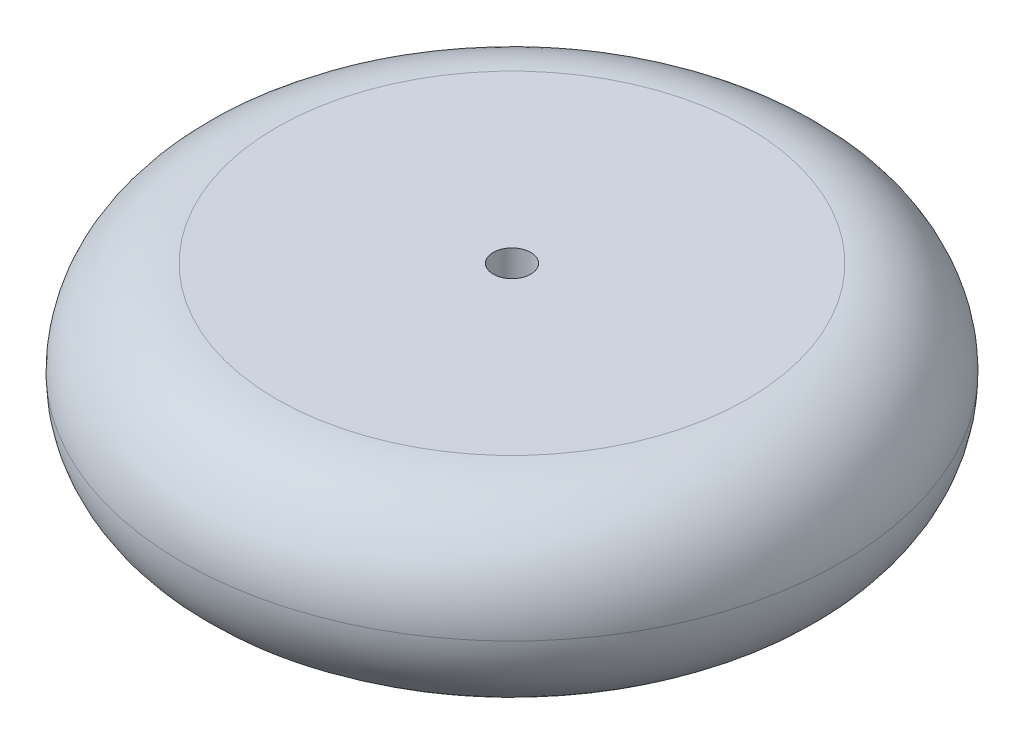
ISO-10303-21;
HEADER;
FILE_DESCRIPTION(('STEP AP214'),'2;1');
FILE_NAME('part.step','',(''),(''),'','','');
FILE_SCHEMA(('AUTOMOTIVE_DESIGN { 1 0 10303 214 1 1 1 1 }'));
ENDSEC;
DATA;
#1=APPLICATION_CONTEXT('core data for automotive mechanical design processes');
#2=APPLICATION_PROTOCOL_DEFINITION('international standard','automotive_design',2000,#1);
#3=PRODUCT_CONTEXT('',#1,'mechanical');
#4=PRODUCT('Part','Part','',(#3));
#5=PRODUCT_RELATED_PRODUCT_CATEGORY('part','',(#4));
#6=PRODUCT_DEFINITION_FORMATION('','',#4);
#7=PRODUCT_DEFINITION_CONTEXT('part definition',#1,'design');
#8=PRODUCT_DEFINITION('design','',#6,#7);
#9=PRODUCT_DEFINITION_SHAPE('','',#8);
#10=(LENGTH_UNIT() NAMED_UNIT(*) SI_UNIT(.MILLI.,.METRE.));
#11=(NAMED_UNIT(*) PLANE_ANGLE_UNIT() SI_UNIT($,.RADIAN.));
#12=(NAMED_UNIT(*) SI_UNIT($,.STERADIAN.) SOLID_ANGLE_UNIT());
#13=UNCERTAINTY_MEASURE_WITH_UNIT(LENGTH_MEASURE(1.E-05),#10,'distance_accuracy_value','');
#14=(GEOMETRIC_REPRESENTATION_CONTEXT(3) GLOBAL_UNCERTAINTY_ASSIGNED_CONTEXT((#13)) GLOBAL_UNIT_ASSIGNED_CONTEXT((#10,
#11,#12)) REPRESENTATION_CONTEXT('',''));
#15=CARTESIAN_POINT('',(0.,0.,0.));
#16=DIRECTION('',(0.,0.,1.));
#17=DIRECTION('',(1.,0.,0.));
#18=AXIS2_PLACEMENT_3D('',#15,#16,#17);
#19=CARTESIAN_POINT('',(0.,4.,0.));
#20=DIRECTION('',(0.,1.,0.));
#21=DIRECTION('',(0.,0.,1.));
#22=AXIS2_PLACEMENT_3D('',#19,#20,#21);
#23=PLANE('',#22);
#24=CARTESIAN_POINT('',(0.,4.,0.));
#25=DIRECTION('',(0.,1.,0.));
#26=DIRECTION('',(0.,0.,1.));
#27=AXIS2_PLACEMENT_3D('',#24,#25,#26);
#28=CIRCLE('',#27,5.);
#29=CARTESIAN_POINT('',(0.,4.,5.));
#30=VERTEX_POINT('',#29);
#31=EDGE_CURVE('E10',#30,#30,#28,.T.);
#32=ORIENTED_EDGE('',*,*,#31,.T.);
#33=EDGE_LOOP('',(#32));
#34=FACE_BOUND('',#33,.T.);
#35=CARTESIAN_POINT('',(0.,4.,0.));
#36=DIRECTION('',(0.,1.,0.));
#37=DIRECTION('',(0.,0.,1.));
#38=AXIS2_PLACEMENT_3D('',#35,#36,#37);
#39=CIRCLE('',#38,0.4);
#40=CARTESIAN_POINT('',(0.,4.,0.4));
#41=VERTEX_POINT('',#40);
#42=EDGE_CURVE('E60',#41,#41,#39,.T.);
#43=ORIENTED_EDGE('',*,*,#42,.F.);
#44=EDGE_LOOP('',(#43));
#45=FACE_BOUND('',#44,.T.);
#46=ADVANCED_FACE('F43',(#34,#45),#23,.T.);
#47=CARTESIAN_POINT('',(0.,0.,0.));
#48=DIRECTION('',(0.,1.,0.));
#49=DIRECTION('',(0.,0.,1.));
#50=AXIS2_PLACEMENT_3D('',#47,#48,#49);
#51=PLANE('',#50);
#52=CARTESIAN_POINT('',(0.,0.,0.));
#53=DIRECTION('',(0.,1.,0.));
#54=DIRECTION('',(0.,0.,1.));
#55=AXIS2_PLACEMENT_3D('',#52,#53,#54);
#56=CIRCLE('',#55,5.);
#57=CARTESIAN_POINT('',(0.,0.,5.));
#58=VERTEX_POINT('',#57);
#59=EDGE_CURVE('E55',#58,#58,#56,.F.);
#60=ORIENTED_EDGE('',*,*,#59,.T.);
#61=EDGE_LOOP('',(#60));
#62=FACE_BOUND('',#61,.T.);
#63=CARTESIAN_POINT('',(0.,0.,0.));
#64=DIRECTION('',(0.,1.,0.));
#65=DIRECTION('',(0.,0.,1.));
#66=AXIS2_PLACEMENT_3D('',#63,#64,#65);
#67=CIRCLE('',#66,0.4);
#68=CARTESIAN_POINT('',(0.,0.,0.4));
#69=VERTEX_POINT('',#68);
#70=EDGE_CURVE('E58',#69,#69,#67,.T.);
#71=ORIENTED_EDGE('',*,*,#70,.T.);
#72=EDGE_LOOP('',(#71));
#73=FACE_BOUND('',#72,.T.);
#74=ADVANCED_FACE('F75',(#62,#73),#51,.F.);
#75=CARTESIAN_POINT('',(0.,4.,0.));
#76=DIRECTION('',(0.,-1.,0.));
#77=DIRECTION('',(0.,0.,-1.));
#78=AXIS2_PLACEMENT_3D('',#75,#76,#77);
#79=CYLINDRICAL_SURFACE('',#78,0.4);
#80=ORIENTED_EDGE('',*,*,#42,.T.);
#81=EDGE_LOOP('',(#80));
#82=FACE_BOUND('',#81,.T.);
#83=ORIENTED_EDGE('',*,*,#70,.F.);
#84=EDGE_LOOP('',(#83));
#85=FACE_BOUND('',#84,.T.);
#86=ADVANCED_FACE('F66',(#82,#85),#79,.F.);
#87=CARTESIAN_POINT('',(0.,2.,0.));
#88=DIRECTION('',(0.,1.,0.));
#89=DIRECTION('',(0.,0.,1.));
#90=AXIS2_PLACEMENT_3D('',#87,#88,#89);
#91=TOROIDAL_SURFACE('',#90,5.,2.);
#92=ORIENTED_EDGE('',*,*,#31,.F.);
#93=EDGE_LOOP('',(#92));
#94=FACE_BOUND('',#93,.T.);
#95=CARTESIAN_POINT('',(0.,2.,0.));
#96=DIRECTION('',(0.,1.,0.));
#97=DIRECTION('',(0.,0.,1.));
#98=AXIS2_PLACEMENT_3D('',#95,#96,#97);
#99=CIRCLE('',#98,7.);
#100=CARTESIAN_POINT('',(0.,2.,7.));
#101=VERTEX_POINT('',#100);
#102=EDGE_CURVE('E50',#101,#101,#99,.F.);
#103=ORIENTED_EDGE('',*,*,#102,.F.);
#104=EDGE_LOOP('',(#103));
#105=FACE_BOUND('',#104,.T.);
#106=ADVANCED_FACE('F44',(#94,#105),#91,.T.);
#107=CARTESIAN_POINT('',(0.,2.,0.));
#108=DIRECTION('',(0.,1.,0.));
#109=DIRECTION('',(0.,0.,1.));
#110=AXIS2_PLACEMENT_3D('',#107,#108,#109);
#111=TOROIDAL_SURFACE('',#110,5.,2.);
#112=ORIENTED_EDGE('',*,*,#59,.F.);
#113=EDGE_LOOP('',(#112));
#114=FACE_BOUND('',#113,.T.);
#115=ORIENTED_EDGE('',*,*,#102,.T.);
#116=EDGE_LOOP('',(#115));
#117=FACE_BOUND('',#116,.T.);
#118=ADVANCED_FACE('F83',(#114,#117),#111,.T.);
#119=CLOSED_SHELL('',(#46,#74,#86,#106,#118));
#120=MANIFOLD_SOLID_BREP('B2',#119);
#121=ADVANCED_BREP_SHAPE_REPRESENTATION('',(#18,#120),#14);
#122=SHAPE_DEFINITION_REPRESENTATION(#9,#121);
ENDSEC;
END-ISO-10303-21;
